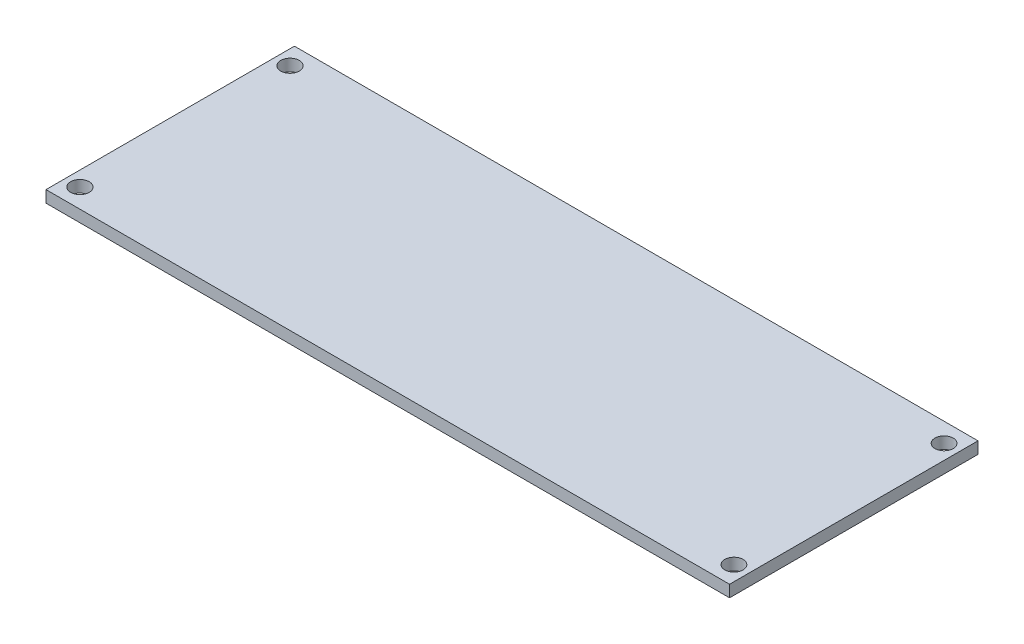
ISO-10303-21;
HEADER;
FILE_DESCRIPTION(('STEP AP214'),'2;1');
FILE_NAME('part.step','',(''),(''),'','','');
FILE_SCHEMA(('AUTOMOTIVE_DESIGN { 1 0 10303 214 1 1 1 1 }'));
ENDSEC;
DATA;
#1=APPLICATION_CONTEXT('core data for automotive mechanical design processes');
#2=APPLICATION_PROTOCOL_DEFINITION('international standard','automotive_design',2000,#1);
#3=PRODUCT_CONTEXT('',#1,'mechanical');
#4=PRODUCT('Part','Part','',(#3));
#5=PRODUCT_RELATED_PRODUCT_CATEGORY('part','',(#4));
#6=PRODUCT_DEFINITION_FORMATION('','',#4);
#7=PRODUCT_DEFINITION_CONTEXT('part definition',#1,'design');
#8=PRODUCT_DEFINITION('design','',#6,#7);
#9=PRODUCT_DEFINITION_SHAPE('','',#8);
#10=(LENGTH_UNIT() NAMED_UNIT(*) SI_UNIT(.MILLI.,.METRE.));
#11=(NAMED_UNIT(*) PLANE_ANGLE_UNIT() SI_UNIT($,.RADIAN.));
#12=(NAMED_UNIT(*) SI_UNIT($,.STERADIAN.) SOLID_ANGLE_UNIT());
#13=UNCERTAINTY_MEASURE_WITH_UNIT(LENGTH_MEASURE(1.E-05),#10,'distance_accuracy_value','');
#14=(GEOMETRIC_REPRESENTATION_CONTEXT(3) GLOBAL_UNCERTAINTY_ASSIGNED_CONTEXT((#13)) GLOBAL_UNIT_ASSIGNED_CONTEXT((#10,
#11,#12)) REPRESENTATION_CONTEXT('',''));
#15=CARTESIAN_POINT('',(0.,0.,0.));
#16=DIRECTION('',(0.,0.,1.));
#17=DIRECTION('',(1.,0.,0.));
#18=AXIS2_PLACEMENT_3D('',#15,#16,#17);
#19=CARTESIAN_POINT('',(0.,-14.,-21.08));
#20=DIRECTION('',(0.,0.,-1.));
#21=DIRECTION('',(-1.,0.,0.));
#22=AXIS2_PLACEMENT_3D('',#19,#20,#21);
#23=PLANE('',#22);
#24=DIRECTION('',(1.,0.,0.));
#25=VECTOR('',#24,1.);
#26=CARTESIAN_POINT('',(0.,-12.,-21.08));
#27=LINE('',#26,#25);
#28=CARTESIAN_POINT('',(-58.,-12.,-21.08));
#29=VERTEX_POINT('',#28);
#30=CARTESIAN_POINT('',(58.,-12.,-21.08));
#31=VERTEX_POINT('',#30);
#32=EDGE_CURVE('E100',#29,#31,#27,.T.);
#33=ORIENTED_EDGE('',*,*,#32,.T.);
#34=DIRECTION('',(0.,1.,0.));
#35=VECTOR('',#34,1.);
#36=CARTESIAN_POINT('',(58.,-14.,-21.08));
#37=LINE('',#36,#35);
#38=CARTESIAN_POINT('',(58.,-14.,-21.08));
#39=VERTEX_POINT('',#38);
#40=EDGE_CURVE('E12',#39,#31,#37,.T.);
#41=ORIENTED_EDGE('',*,*,#40,.F.);
#42=DIRECTION('',(-1.,0.,0.));
#43=VECTOR('',#42,1.);
#44=CARTESIAN_POINT('',(0.,-14.,-21.08));
#45=LINE('',#44,#43);
#46=CARTESIAN_POINT('',(-58.,-14.,-21.08));
#47=VERTEX_POINT('',#46);
#48=EDGE_CURVE('E145',#39,#47,#45,.T.);
#49=ORIENTED_EDGE('',*,*,#48,.T.);
#50=DIRECTION('',(0.,1.,0.));
#51=VECTOR('',#50,1.);
#52=CARTESIAN_POINT('',(-58.,-14.,-21.08));
#53=LINE('',#52,#51);
#54=EDGE_CURVE('E107',#47,#29,#53,.T.);
#55=ORIENTED_EDGE('',*,*,#54,.T.);
#56=EDGE_LOOP('',(#33,#41,#49,#55));
#57=FACE_BOUND('',#56,.T.);
#58=ADVANCED_FACE('F85',(#57),#23,.T.);
#59=CARTESIAN_POINT('',(58.,-14.,0.));
#60=DIRECTION('',(1.,0.,0.));
#61=DIRECTION('',(0.,0.,-1.));
#62=AXIS2_PLACEMENT_3D('',#59,#60,#61);
#63=PLANE('',#62);
#64=DIRECTION('',(0.,0.,1.));
#65=VECTOR('',#64,1.);
#66=CARTESIAN_POINT('',(58.,-12.,-21.08));
#67=LINE('',#66,#65);
#68=CARTESIAN_POINT('',(58.,-12.,21.08));
#69=VERTEX_POINT('',#68);
#70=EDGE_CURVE('E125',#31,#69,#67,.T.);
#71=ORIENTED_EDGE('',*,*,#70,.T.);
#72=DIRECTION('',(0.,1.,0.));
#73=VECTOR('',#72,1.);
#74=CARTESIAN_POINT('',(58.,-14.,21.08));
#75=LINE('',#74,#73);
#76=CARTESIAN_POINT('',(58.,-14.,21.08));
#77=VERTEX_POINT('',#76);
#78=EDGE_CURVE('E93',#77,#69,#75,.T.);
#79=ORIENTED_EDGE('',*,*,#78,.F.);
#80=DIRECTION('',(0.,0.,-1.));
#81=VECTOR('',#80,1.);
#82=CARTESIAN_POINT('',(58.,-14.,0.));
#83=LINE('',#82,#81);
#84=EDGE_CURVE('E140',#77,#39,#83,.T.);
#85=ORIENTED_EDGE('',*,*,#84,.T.);
#86=ORIENTED_EDGE('',*,*,#40,.T.);
#87=EDGE_LOOP('',(#71,#79,#85,#86));
#88=FACE_BOUND('',#87,.T.);
#89=ADVANCED_FACE('F138',(#88),#63,.T.);
#90=CARTESIAN_POINT('',(0.,-14.,21.08));
#91=DIRECTION('',(0.,0.,1.));
#92=DIRECTION('',(1.,0.,0.));
#93=AXIS2_PLACEMENT_3D('',#90,#91,#92);
#94=PLANE('',#93);
#95=DIRECTION('',(1.,0.,0.));
#96=VECTOR('',#95,1.);
#97=CARTESIAN_POINT('',(0.,-12.,21.08));
#98=LINE('',#97,#96);
#99=CARTESIAN_POINT('',(-58.,-12.,21.08));
#100=VERTEX_POINT('',#99);
#101=EDGE_CURVE('E128',#100,#69,#98,.T.);
#102=ORIENTED_EDGE('',*,*,#101,.F.);
#103=DIRECTION('',(0.,1.,0.));
#104=VECTOR('',#103,1.);
#105=CARTESIAN_POINT('',(-58.,-14.,21.08));
#106=LINE('',#105,#104);
#107=CARTESIAN_POINT('',(-58.,-14.,21.08));
#108=VERTEX_POINT('',#107);
#109=EDGE_CURVE('E155',#108,#100,#106,.T.);
#110=ORIENTED_EDGE('',*,*,#109,.F.);
#111=DIRECTION('',(1.,0.,0.));
#112=VECTOR('',#111,1.);
#113=CARTESIAN_POINT('',(0.,-14.,21.08));
#114=LINE('',#113,#112);
#115=EDGE_CURVE('E144',#108,#77,#114,.T.);
#116=ORIENTED_EDGE('',*,*,#115,.T.);
#117=ORIENTED_EDGE('',*,*,#78,.T.);
#118=EDGE_LOOP('',(#102,#110,#116,#117));
#119=FACE_BOUND('',#118,.T.);
#120=ADVANCED_FACE('F158',(#119),#94,.T.);
#121=CARTESIAN_POINT('',(55.4922151882381,-14.,17.83));
#122=DIRECTION('',(0.,1.,0.));
#123=DIRECTION('',(0.,0.,1.));
#124=AXIS2_PLACEMENT_3D('',#121,#122,#123);
#125=CYLINDRICAL_SURFACE('',#124,1.55);
#126=CARTESIAN_POINT('',(55.4922151882381,-12.,17.83));
#127=DIRECTION('',(0.,-1.,0.));
#128=DIRECTION('',(0.,0.,-1.));
#129=AXIS2_PLACEMENT_3D('',#126,#127,#128);
#130=CIRCLE('',#129,1.55);
#131=CARTESIAN_POINT('',(55.4922151882381,-12.,16.28));
#132=VERTEX_POINT('',#131);
#133=EDGE_CURVE('E173',#132,#132,#130,.T.);
#134=ORIENTED_EDGE('',*,*,#133,.F.);
#135=EDGE_LOOP('',(#134));
#136=FACE_BOUND('',#135,.T.);
#137=CARTESIAN_POINT('',(55.4922151882381,-14.,17.83));
#138=DIRECTION('',(0.,-1.,0.));
#139=DIRECTION('',(0.,0.,-1.));
#140=AXIS2_PLACEMENT_3D('',#137,#138,#139);
#141=CIRCLE('',#140,1.55);
#142=CARTESIAN_POINT('',(55.4922151882381,-14.,16.28));
#143=VERTEX_POINT('',#142);
#144=EDGE_CURVE('E149',#143,#143,#141,.T.);
#145=ORIENTED_EDGE('',*,*,#144,.T.);
#146=EDGE_LOOP('',(#145));
#147=FACE_BOUND('',#146,.T.);
#148=ADVANCED_FACE('F187',(#136,#147),#125,.F.);
#149=CARTESIAN_POINT('',(55.4922151882381,-14.,-17.83));
#150=DIRECTION('',(0.,1.,0.));
#151=DIRECTION('',(0.,0.,1.));
#152=AXIS2_PLACEMENT_3D('',#149,#150,#151);
#153=CYLINDRICAL_SURFACE('',#152,1.55);
#154=CARTESIAN_POINT('',(55.4922151882381,-12.,-17.83));
#155=DIRECTION('',(0.,-1.,0.));
#156=DIRECTION('',(0.,0.,-1.));
#157=AXIS2_PLACEMENT_3D('',#154,#155,#156);
#158=CIRCLE('',#157,1.55);
#159=CARTESIAN_POINT('',(55.4922151882381,-12.,-19.38));
#160=VERTEX_POINT('',#159);
#161=EDGE_CURVE('E170',#160,#160,#158,.T.);
#162=ORIENTED_EDGE('',*,*,#161,.F.);
#163=EDGE_LOOP('',(#162));
#164=FACE_BOUND('',#163,.T.);
#165=CARTESIAN_POINT('',(55.4922151882381,-14.,-17.83));
#166=DIRECTION('',(0.,-1.,0.));
#167=DIRECTION('',(0.,0.,-1.));
#168=AXIS2_PLACEMENT_3D('',#165,#166,#167);
#169=CIRCLE('',#168,1.55);
#170=CARTESIAN_POINT('',(55.4922151882381,-14.,-19.38));
#171=VERTEX_POINT('',#170);
#172=EDGE_CURVE('E182',#171,#171,#169,.T.);
#173=ORIENTED_EDGE('',*,*,#172,.T.);
#174=EDGE_LOOP('',(#173));
#175=FACE_BOUND('',#174,.T.);
#176=ADVANCED_FACE('F211',(#164,#175),#153,.F.);
#177=CARTESIAN_POINT('',(-55.496107594119,-14.,17.83));
#178=DIRECTION('',(0.,1.,0.));
#179=DIRECTION('',(0.,0.,1.));
#180=AXIS2_PLACEMENT_3D('',#177,#178,#179);
#181=CYLINDRICAL_SURFACE('',#180,1.575);
#182=CARTESIAN_POINT('',(-55.496107594119,-12.,17.83));
#183=DIRECTION('',(0.,-1.,0.));
#184=DIRECTION('',(0.,0.,-1.));
#185=AXIS2_PLACEMENT_3D('',#182,#183,#184);
#186=CIRCLE('',#185,1.575);
#187=CARTESIAN_POINT('',(-55.496107594119,-12.,16.255));
#188=VERTEX_POINT('',#187);
#189=EDGE_CURVE('E167',#188,#188,#186,.T.);
#190=ORIENTED_EDGE('',*,*,#189,.F.);
#191=EDGE_LOOP('',(#190));
#192=FACE_BOUND('',#191,.T.);
#193=CARTESIAN_POINT('',(-55.496107594119,-14.,17.83));
#194=DIRECTION('',(0.,-1.,0.));
#195=DIRECTION('',(0.,0.,-1.));
#196=AXIS2_PLACEMENT_3D('',#193,#194,#195);
#197=CIRCLE('',#196,1.575);
#198=CARTESIAN_POINT('',(-55.496107594119,-14.,16.255));
#199=VERTEX_POINT('',#198);
#200=EDGE_CURVE('E179',#199,#199,#197,.T.);
#201=ORIENTED_EDGE('',*,*,#200,.T.);
#202=EDGE_LOOP('',(#201));
#203=FACE_BOUND('',#202,.T.);
#204=ADVANCED_FACE('F214',(#192,#203),#181,.F.);
#205=CARTESIAN_POINT('',(-55.496107594119,-14.,-17.83));
#206=DIRECTION('',(0.,1.,0.));
#207=DIRECTION('',(0.,0.,1.));
#208=AXIS2_PLACEMENT_3D('',#205,#206,#207);
#209=CYLINDRICAL_SURFACE('',#208,1.575);
#210=CARTESIAN_POINT('',(-55.496107594119,-12.,-17.83));
#211=DIRECTION('',(0.,-1.,0.));
#212=DIRECTION('',(0.,0.,-1.));
#213=AXIS2_PLACEMENT_3D('',#210,#211,#212);
#214=CIRCLE('',#213,1.575);
#215=CARTESIAN_POINT('',(-55.496107594119,-12.,-19.405));
#216=VERTEX_POINT('',#215);
#217=EDGE_CURVE('E131',#216,#216,#214,.T.);
#218=ORIENTED_EDGE('',*,*,#217,.F.);
#219=EDGE_LOOP('',(#218));
#220=FACE_BOUND('',#219,.T.);
#221=CARTESIAN_POINT('',(-55.496107594119,-14.,-17.83));
#222=DIRECTION('',(0.,-1.,0.));
#223=DIRECTION('',(0.,0.,-1.));
#224=AXIS2_PLACEMENT_3D('',#221,#222,#223);
#225=CIRCLE('',#224,1.575);
#226=CARTESIAN_POINT('',(-55.496107594119,-14.,-19.405));
#227=VERTEX_POINT('',#226);
#228=EDGE_CURVE('E176',#227,#227,#225,.T.);
#229=ORIENTED_EDGE('',*,*,#228,.T.);
#230=EDGE_LOOP('',(#229));
#231=FACE_BOUND('',#230,.T.);
#232=ADVANCED_FACE('F87',(#220,#231),#209,.F.);
#233=CARTESIAN_POINT('',(-58.,-14.,0.));
#234=DIRECTION('',(-1.,0.,0.));
#235=DIRECTION('',(0.,0.,1.));
#236=AXIS2_PLACEMENT_3D('',#233,#234,#235);
#237=PLANE('',#236);
#238=DIRECTION('',(0.,0.,1.));
#239=VECTOR('',#238,1.);
#240=CARTESIAN_POINT('',(-58.,-12.,-21.08));
#241=LINE('',#240,#239);
#242=EDGE_CURVE('E132',#29,#100,#241,.T.);
#243=ORIENTED_EDGE('',*,*,#242,.F.);
#244=ORIENTED_EDGE('',*,*,#54,.F.);
#245=DIRECTION('',(0.,0.,1.));
#246=VECTOR('',#245,1.);
#247=CARTESIAN_POINT('',(-58.,-14.,0.));
#248=LINE('',#247,#246);
#249=EDGE_CURVE('E147',#47,#108,#248,.T.);
#250=ORIENTED_EDGE('',*,*,#249,.T.);
#251=ORIENTED_EDGE('',*,*,#109,.T.);
#252=EDGE_LOOP('',(#243,#244,#250,#251));
#253=FACE_BOUND('',#252,.T.);
#254=ADVANCED_FACE('F161',(#253),#237,.T.);
#255=CARTESIAN_POINT('',(0.,-14.,0.));
#256=DIRECTION('',(0.,-1.,0.));
#257=DIRECTION('',(0.,0.,-1.));
#258=AXIS2_PLACEMENT_3D('',#255,#256,#257);
#259=PLANE('',#258);
#260=ORIENTED_EDGE('',*,*,#228,.F.);
#261=EDGE_LOOP('',(#260));
#262=FACE_BOUND('',#261,.T.);
#263=ORIENTED_EDGE('',*,*,#200,.F.);
#264=EDGE_LOOP('',(#263));
#265=FACE_BOUND('',#264,.T.);
#266=ORIENTED_EDGE('',*,*,#172,.F.);
#267=EDGE_LOOP('',(#266));
#268=FACE_BOUND('',#267,.T.);
#269=ORIENTED_EDGE('',*,*,#144,.F.);
#270=EDGE_LOOP('',(#269));
#271=FACE_BOUND('',#270,.T.);
#272=ORIENTED_EDGE('',*,*,#48,.F.);
#273=ORIENTED_EDGE('',*,*,#84,.F.);
#274=ORIENTED_EDGE('',*,*,#115,.F.);
#275=ORIENTED_EDGE('',*,*,#249,.F.);
#276=EDGE_LOOP('',(#272,#273,#274,#275));
#277=FACE_BOUND('',#276,.T.);
#278=ADVANCED_FACE('F160',(#262,#265,#268,#271,#277),#259,.T.);
#279=CARTESIAN_POINT('',(0.,-12.,-21.08));
#280=DIRECTION('',(0.,-1.,0.));
#281=DIRECTION('',(0.,0.,-1.));
#282=AXIS2_PLACEMENT_3D('',#279,#280,#281);
#283=PLANE('',#282);
#284=ORIENTED_EDGE('',*,*,#133,.T.);
#285=EDGE_LOOP('',(#284));
#286=FACE_BOUND('',#285,.T.);
#287=ORIENTED_EDGE('',*,*,#161,.T.);
#288=EDGE_LOOP('',(#287));
#289=FACE_BOUND('',#288,.T.);
#290=ORIENTED_EDGE('',*,*,#189,.T.);
#291=EDGE_LOOP('',(#290));
#292=FACE_BOUND('',#291,.T.);
#293=ORIENTED_EDGE('',*,*,#217,.T.);
#294=EDGE_LOOP('',(#293));
#295=FACE_BOUND('',#294,.T.);
#296=ORIENTED_EDGE('',*,*,#101,.T.);
#297=ORIENTED_EDGE('',*,*,#70,.F.);
#298=ORIENTED_EDGE('',*,*,#32,.F.);
#299=ORIENTED_EDGE('',*,*,#242,.T.);
#300=EDGE_LOOP('',(#296,#297,#298,#299));
#301=FACE_BOUND('',#300,.T.);
#302=ADVANCED_FACE('F126',(#286,#289,#292,#295,#301),#283,.F.);
#303=CLOSED_SHELL('',(#58,#89,#120,#148,#176,#204,#232,#254,#278,#302));
#304=MANIFOLD_SOLID_BREP('B2',#303);
#305=ADVANCED_BREP_SHAPE_REPRESENTATION('',(#18,#304),#14);
#306=SHAPE_DEFINITION_REPRESENTATION(#9,#305);
ENDSEC;
END-ISO-10303-21;
